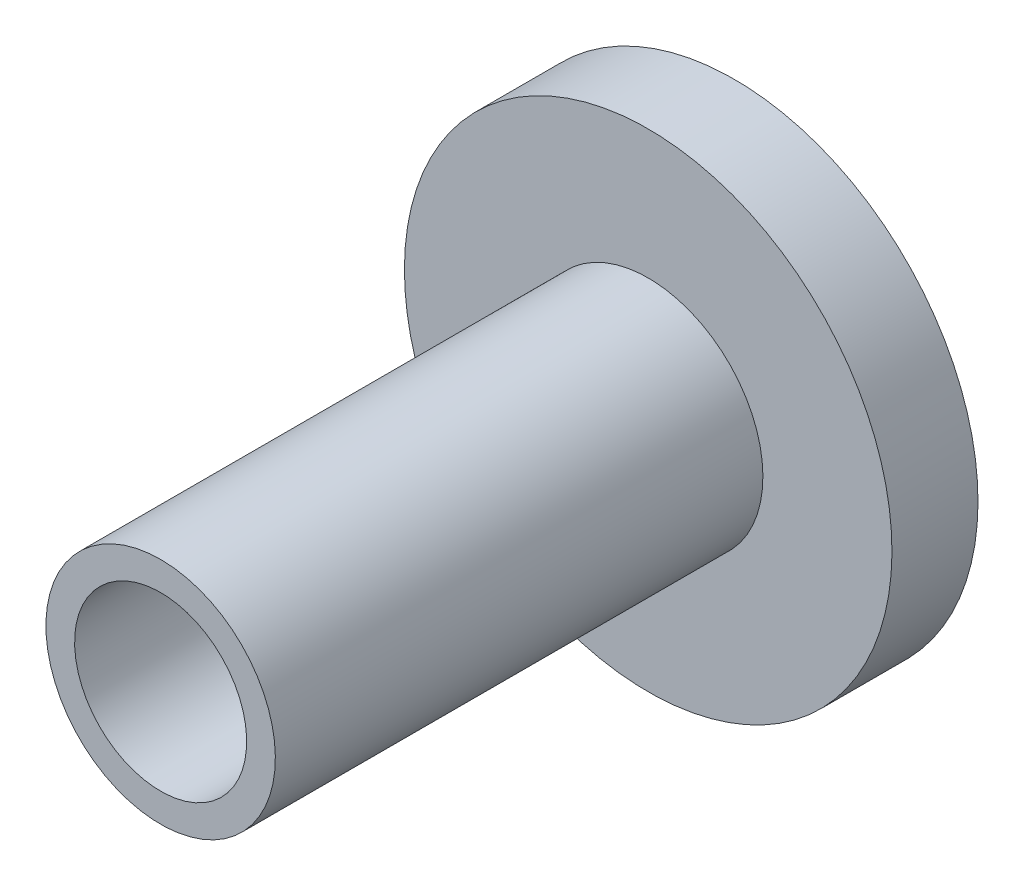
ISO-10303-21;
HEADER;
FILE_DESCRIPTION(('STEP AP214'),'2;1');
FILE_NAME('part.step','',(''),(''),'','','');
FILE_SCHEMA(('AUTOMOTIVE_DESIGN { 1 0 10303 214 1 1 1 1 }'));
ENDSEC;
DATA;
#1=APPLICATION_CONTEXT('core data for automotive mechanical design processes');
#2=APPLICATION_PROTOCOL_DEFINITION('international standard','automotive_design',2000,#1);
#3=PRODUCT_CONTEXT('',#1,'mechanical');
#4=PRODUCT('Part','Part','',(#3));
#5=PRODUCT_RELATED_PRODUCT_CATEGORY('part','',(#4));
#6=PRODUCT_DEFINITION_FORMATION('','',#4);
#7=PRODUCT_DEFINITION_CONTEXT('part definition',#1,'design');
#8=PRODUCT_DEFINITION('design','',#6,#7);
#9=PRODUCT_DEFINITION_SHAPE('','',#8);
#10=(LENGTH_UNIT() NAMED_UNIT(*) SI_UNIT(.MILLI.,.METRE.));
#11=(NAMED_UNIT(*) PLANE_ANGLE_UNIT() SI_UNIT($,.RADIAN.));
#12=(NAMED_UNIT(*) SI_UNIT($,.STERADIAN.) SOLID_ANGLE_UNIT());
#13=UNCERTAINTY_MEASURE_WITH_UNIT(LENGTH_MEASURE(1.E-05),#10,'distance_accuracy_value','');
#14=(GEOMETRIC_REPRESENTATION_CONTEXT(3) GLOBAL_UNCERTAINTY_ASSIGNED_CONTEXT((#13)) GLOBAL_UNIT_ASSIGNED_CONTEXT((#10,
#11,#12)) REPRESENTATION_CONTEXT('',''));
#15=CARTESIAN_POINT('',(0.,0.,0.));
#16=DIRECTION('',(0.,0.,1.));
#17=DIRECTION('',(1.,0.,0.));
#18=AXIS2_PLACEMENT_3D('',#15,#16,#17);
#19=CARTESIAN_POINT('',(4.37678810736121,-168.89010860896,356.074757540733));
#20=DIRECTION('',(0.,0.,-1.));
#21=DIRECTION('',(0.,-1.,0.));
#22=AXIS2_PLACEMENT_3D('',#19,#20,#21);
#23=PLANE('',#22);
#24=CARTESIAN_POINT('',(4.37678810736121,-168.89010860896,356.074757540733));
#25=DIRECTION('',(0.,0.,1.));
#26=DIRECTION('',(-0.951056516295153,0.309016994374948,0.));
#27=AXIS2_PLACEMENT_3D('',#24,#25,#26);
#28=CIRCLE('',#27,1.5);
#29=CARTESIAN_POINT('',(2.95020333291848,-168.426583117397,356.074757540733));
#30=VERTEX_POINT('',#29);
#31=EDGE_CURVE('E11',#30,#30,#28,.T.);
#32=ORIENTED_EDGE('',*,*,#31,.T.);
#33=EDGE_LOOP('',(#32));
#34=FACE_BOUND('',#33,.T.);
#35=ADVANCED_FACE('F43',(#34),#23,.F.);
#36=CARTESIAN_POINT('',(4.37678810736121,-168.89010860896,364.274757540733));
#37=DIRECTION('',(0.,0.,-1.));
#38=DIRECTION('',(0.309016994374947,0.951056516295154,0.));
#39=AXIS2_PLACEMENT_3D('',#36,#37,#38);
#40=CYLINDRICAL_SURFACE('',#39,1.5);
#41=ORIENTED_EDGE('',*,*,#31,.F.);
#42=EDGE_LOOP('',(#41));
#43=FACE_BOUND('',#42,.T.);
#44=CARTESIAN_POINT('',(4.37678810736121,-168.89010860896,364.574757540733));
#45=DIRECTION('',(0.,0.,1.));
#46=DIRECTION('',(0.951056516295153,-0.309016994374948,0.));
#47=AXIS2_PLACEMENT_3D('',#44,#45,#46);
#48=CIRCLE('',#47,1.5);
#49=CARTESIAN_POINT('',(5.80337288180394,-169.353634100522,364.574757540733));
#50=VERTEX_POINT('',#49);
#51=EDGE_CURVE('E52',#50,#50,#48,.T.);
#52=ORIENTED_EDGE('',*,*,#51,.T.);
#53=EDGE_LOOP('',(#52));
#54=FACE_BOUND('',#53,.T.);
#55=ADVANCED_FACE('F205',(#43,#54),#40,.F.);
#56=CARTESIAN_POINT('',(4.37678810736121,-168.89010860896,364.574757540733));
#57=DIRECTION('',(0.,0.,1.));
#58=DIRECTION('',(1.,0.,0.));
#59=AXIS2_PLACEMENT_3D('',#56,#57,#58);
#60=PLANE('',#59);
#61=CARTESIAN_POINT('',(4.37678810736121,-168.89010860896,364.574757540733));
#62=DIRECTION('',(0.,0.,1.));
#63=DIRECTION('',(0.951056516295152,-0.309016994374953,0.));
#64=AXIS2_PLACEMENT_3D('',#61,#62,#63);
#65=CIRCLE('',#64,2.);
#66=CARTESIAN_POINT('',(6.27890113995152,-169.508142597709,364.574757540733));
#67=VERTEX_POINT('',#66);
#68=EDGE_CURVE('E79',#67,#67,#65,.T.);
#69=ORIENTED_EDGE('',*,*,#68,.T.);
#70=EDGE_LOOP('',(#69));
#71=FACE_BOUND('',#70,.T.);
#72=ORIENTED_EDGE('',*,*,#51,.F.);
#73=EDGE_LOOP('',(#72));
#74=FACE_BOUND('',#73,.T.);
#75=ADVANCED_FACE('F211',(#71,#74),#60,.T.);
#76=CARTESIAN_POINT('',(-47.7978887522086,-256.655723143352,355.524757540733));
#77=DIRECTION('',(0.,0.,-1.));
#78=DIRECTION('',(0.,-1.,0.));
#79=AXIS2_PLACEMENT_3D('',#76,#77,#78);
#80=PLANE('',#79);
#81=DIRECTION('',(-0.207911690817758,0.978147600733806,0.));
#82=VECTOR('',#81,1.);
#83=CARTESIAN_POINT('',(18.5029435175928,-242.563046200222,355.524757540733));
#84=LINE('',#83,#82);
#85=CARTESIAN_POINT('',(3.08962351225286,-170.049076816073,355.524757540733));
#86=VERTEX_POINT('',#85);
#87=CARTESIAN_POINT('',(2.72950990026894,-168.3548754743,355.524757540733));
#88=VERTEX_POINT('',#87);
#89=EDGE_CURVE('E126',#86,#88,#84,.T.);
#90=ORIENTED_EDGE('',*,*,#89,.T.);
#91=DIRECTION('',(0.743144825477395,0.669130606358857,0.));
#92=VECTOR('',#91,1.);
#93=CARTESIAN_POINT('',(-69.0835282862229,-233.015625490732,355.524757540733));
#94=LINE('',#93,#92);
#95=CARTESIAN_POINT('',(4.01667449537771,-167.195907267187,355.524757540733));
#96=VERTEX_POINT('',#95);
#97=EDGE_CURVE('E154',#88,#96,#94,.T.);
#98=ORIENTED_EDGE('',*,*,#97,.T.);
#99=DIRECTION('',(0.951056516295153,-0.309016994374949,0.));
#100=VECTOR('',#99,1.);
#101=CARTESIAN_POINT('',(-16.5584580177169,-160.510641461081,355.524757540733));
#102=LINE('',#101,#100);
#103=CARTESIAN_POINT('',(5.66395270247036,-167.731140401847,355.524757540733));
#104=VERTEX_POINT('',#103);
#105=EDGE_CURVE('E110',#96,#104,#102,.T.);
#106=ORIENTED_EDGE('',*,*,#105,.T.);
#107=DIRECTION('',(0.207911690817758,-0.978147600733806,0.));
#108=VECTOR('',#107,1.);
#109=CARTESIAN_POINT('',(21.437386319794,-241.939311127769,355.524757540733));
#110=LINE('',#109,#108);
#111=CARTESIAN_POINT('',(6.02406631445428,-169.425341743619,355.524757540733));
#112=VERTEX_POINT('',#111);
#113=EDGE_CURVE('E114',#104,#112,#110,.T.);
#114=ORIENTED_EDGE('',*,*,#113,.T.);
#115=DIRECTION('',(-0.743144825477395,-0.669130606358858,0.));
#116=VECTOR('',#115,1.);
#117=CARTESIAN_POINT('',(-67.0761364671462,-235.245059967164,355.524757540733));
#118=LINE('',#117,#116);
#119=CARTESIAN_POINT('',(4.7369017193455,-170.584309950733,355.524757540733));
#120=VERTEX_POINT('',#119);
#121=EDGE_CURVE('E129',#112,#120,#118,.T.);
#122=ORIENTED_EDGE('',*,*,#121,.T.);
#123=DIRECTION('',(-0.951056516295153,0.309016994374949,0.));
#124=VECTOR('',#123,1.);
#125=CARTESIAN_POINT('',(-17.4855090008418,-163.363811009966,355.524757540733));
#126=LINE('',#125,#124);
#127=EDGE_CURVE('E122',#120,#86,#126,.T.);
#128=ORIENTED_EDGE('',*,*,#127,.T.);
#129=EDGE_LOOP('',(#90,#98,#106,#114,#122,#128));
#130=FACE_BOUND('',#129,.T.);
#131=ADVANCED_FACE('F124',(#130),#80,.T.);
#132=CARTESIAN_POINT('',(3.90941077911864,-167.292487951114,355.274757540733));
#133=DIRECTION('',(-0.669130606358857,0.743144825477395,0.));
#134=DIRECTION('',(0.,0.,1.));
#135=AXIS2_PLACEMENT_3D('',#132,#133,#134);
#136=PLANE('',#135);
#137=DIRECTION('',(-0.743144825477396,-0.669130606358857,0.));
#138=VECTOR('',#137,1.);
#139=CARTESIAN_POINT('',(3.90941077911864,-167.292487951114,354.574757540733));
#140=LINE('',#139,#138);
#141=CARTESIAN_POINT('',(4.01667449537771,-167.195907267187,354.574757540733));
#142=VERTEX_POINT('',#141);
#143=CARTESIAN_POINT('',(2.72950990026894,-168.3548754743,354.574757540733));
#144=VERTEX_POINT('',#143);
#145=EDGE_CURVE('E146',#142,#144,#140,.T.);
#146=ORIENTED_EDGE('',*,*,#145,.F.);
#147=DIRECTION('',(0.,0.,1.));
#148=VECTOR('',#147,1.);
#149=CARTESIAN_POINT('',(4.01667449537771,-167.195907267187,355.274757540733));
#150=LINE('',#149,#148);
#151=EDGE_CURVE('E151',#142,#96,#150,.T.);
#152=ORIENTED_EDGE('',*,*,#151,.T.);
#153=ORIENTED_EDGE('',*,*,#97,.F.);
#154=DIRECTION('',(0.,0.,1.));
#155=VECTOR('',#154,1.);
#156=CARTESIAN_POINT('',(2.72950990026894,-168.3548754743,355.274757540733));
#157=LINE('',#156,#155);
#158=EDGE_CURVE('E144',#144,#88,#157,.T.);
#159=ORIENTED_EDGE('',*,*,#158,.F.);
#160=EDGE_LOOP('',(#146,#152,#153,#159));
#161=FACE_BOUND('',#160,.T.);
#162=ADVANCED_FACE('F186',(#161),#136,.F.);
#163=CARTESIAN_POINT('',(5.52667951854598,-167.686537640625,355.274757540733));
#164=DIRECTION('',(0.309016994374949,0.951056516295153,0.));
#165=DIRECTION('',(0.,0.,-1.));
#166=AXIS2_PLACEMENT_3D('',#163,#164,#165);
#167=PLANE('',#166);
#168=DIRECTION('',(-0.951056516295153,0.309016994374949,0.));
#169=VECTOR('',#168,1.);
#170=CARTESIAN_POINT('',(5.52667951854598,-167.686537640625,354.574757540733));
#171=LINE('',#170,#169);
#172=CARTESIAN_POINT('',(5.66395270247036,-167.731140401847,354.574757540733));
#173=VERTEX_POINT('',#172);
#174=EDGE_CURVE('E165',#173,#142,#171,.T.);
#175=ORIENTED_EDGE('',*,*,#174,.F.);
#176=DIRECTION('',(0.,0.,1.));
#177=VECTOR('',#176,1.);
#178=CARTESIAN_POINT('',(5.66395270247036,-167.731140401847,355.274757540733));
#179=LINE('',#178,#177);
#180=EDGE_CURVE('E152',#173,#104,#179,.T.);
#181=ORIENTED_EDGE('',*,*,#180,.T.);
#182=ORIENTED_EDGE('',*,*,#105,.F.);
#183=ORIENTED_EDGE('',*,*,#151,.F.);
#184=EDGE_LOOP('',(#175,#181,#182,#183));
#185=FACE_BOUND('',#184,.T.);
#186=ADVANCED_FACE('F188',(#185),#167,.F.);
#187=CARTESIAN_POINT('',(5.99405684678894,-169.284158298472,346.074757540733));
#188=DIRECTION('',(0.978147600733806,0.207911690817758,0.));
#189=DIRECTION('',(0.,0.,-1.));
#190=AXIS2_PLACEMENT_3D('',#187,#188,#189);
#191=PLANE('',#190);
#192=DIRECTION('',(-0.207911690817757,0.978147600733806,0.));
#193=VECTOR('',#192,1.);
#194=CARTESIAN_POINT('',(5.99405684678894,-169.284158298472,354.574757540733));
#195=LINE('',#194,#193);
#196=CARTESIAN_POINT('',(6.02406631445428,-169.425341743619,354.574757540733));
#197=VERTEX_POINT('',#196);
#198=EDGE_CURVE('E47',#197,#173,#195,.T.);
#199=ORIENTED_EDGE('',*,*,#198,.F.);
#200=DIRECTION('',(0.,0.,1.));
#201=VECTOR('',#200,1.);
#202=CARTESIAN_POINT('',(6.02406631445428,-169.425341743619,346.074757540733));
#203=LINE('',#202,#201);
#204=EDGE_CURVE('E171',#197,#112,#203,.T.);
#205=ORIENTED_EDGE('',*,*,#204,.T.);
#206=ORIENTED_EDGE('',*,*,#113,.F.);
#207=ORIENTED_EDGE('',*,*,#180,.F.);
#208=EDGE_LOOP('',(#199,#205,#206,#207));
#209=FACE_BOUND('',#208,.T.);
#210=ADVANCED_FACE('F191',(#209),#191,.F.);
#211=CARTESIAN_POINT('',(4.84416543560456,-170.487729266806,346.074757540733));
#212=DIRECTION('',(0.669130606358858,-0.743144825477395,0.));
#213=DIRECTION('',(0.,0.,-1.));
#214=AXIS2_PLACEMENT_3D('',#211,#212,#213);
#215=PLANE('',#214);
#216=DIRECTION('',(0.743144825477395,0.669130606358858,0.));
#217=VECTOR('',#216,1.);
#218=CARTESIAN_POINT('',(4.84416543560456,-170.487729266806,354.574757540733));
#219=LINE('',#218,#217);
#220=CARTESIAN_POINT('',(4.7369017193455,-170.584309950733,354.574757540733));
#221=VERTEX_POINT('',#220);
#222=EDGE_CURVE('E160',#221,#197,#219,.T.);
#223=ORIENTED_EDGE('',*,*,#222,.F.);
#224=DIRECTION('',(0.,0.,1.));
#225=VECTOR('',#224,1.);
#226=CARTESIAN_POINT('',(4.7369017193455,-170.584309950733,355.274757540733));
#227=LINE('',#226,#225);
#228=EDGE_CURVE('E132',#221,#120,#227,.T.);
#229=ORIENTED_EDGE('',*,*,#228,.T.);
#230=ORIENTED_EDGE('',*,*,#121,.F.);
#231=ORIENTED_EDGE('',*,*,#204,.F.);
#232=EDGE_LOOP('',(#223,#229,#230,#231));
#233=FACE_BOUND('',#232,.T.);
#234=ADVANCED_FACE('F193',(#233),#215,.F.);
#235=CARTESIAN_POINT('',(3.22689669617726,-170.093679577295,355.274757540733));
#236=DIRECTION('',(-0.309016994374949,-0.951056516295153,0.));
#237=DIRECTION('',(-0.951056516295153,0.309016994374949,0.));
#238=AXIS2_PLACEMENT_3D('',#235,#236,#237);
#239=PLANE('',#238);
#240=DIRECTION('',(0.951056516295153,-0.309016994374949,0.));
#241=VECTOR('',#240,1.);
#242=CARTESIAN_POINT('',(3.22689669617726,-170.093679577295,354.574757540733));
#243=LINE('',#242,#241);
#244=CARTESIAN_POINT('',(3.08962351225286,-170.049076816073,354.574757540733));
#245=VERTEX_POINT('',#244);
#246=EDGE_CURVE('E138',#245,#221,#243,.T.);
#247=ORIENTED_EDGE('',*,*,#246,.F.);
#248=DIRECTION('',(0.,0.,1.));
#249=VECTOR('',#248,1.);
#250=CARTESIAN_POINT('',(3.08962351225286,-170.049076816073,355.274757540733));
#251=LINE('',#250,#249);
#252=EDGE_CURVE('E133',#245,#86,#251,.T.);
#253=ORIENTED_EDGE('',*,*,#252,.T.);
#254=ORIENTED_EDGE('',*,*,#127,.F.);
#255=ORIENTED_EDGE('',*,*,#228,.F.);
#256=EDGE_LOOP('',(#247,#253,#254,#255));
#257=FACE_BOUND('',#256,.T.);
#258=ADVANCED_FACE('F136',(#257),#239,.F.);
#259=CARTESIAN_POINT('',(2.75951936793427,-168.496058919448,355.274757540733));
#260=DIRECTION('',(-0.978147600733806,-0.207911690817758,0.));
#261=DIRECTION('',(-0.207911690817758,0.978147600733806,0.));
#262=AXIS2_PLACEMENT_3D('',#259,#260,#261);
#263=PLANE('',#262);
#264=DIRECTION('',(0.207911690817758,-0.978147600733806,0.));
#265=VECTOR('',#264,1.);
#266=CARTESIAN_POINT('',(2.75951936793427,-168.496058919448,354.574757540733));
#267=LINE('',#266,#265);
#268=EDGE_CURVE('E158',#144,#245,#267,.T.);
#269=ORIENTED_EDGE('',*,*,#268,.F.);
#270=ORIENTED_EDGE('',*,*,#158,.T.);
#271=ORIENTED_EDGE('',*,*,#89,.F.);
#272=ORIENTED_EDGE('',*,*,#252,.F.);
#273=EDGE_LOOP('',(#269,#270,#271,#272));
#274=FACE_BOUND('',#273,.T.);
#275=ADVANCED_FACE('F45',(#274),#263,.F.);
#276=CARTESIAN_POINT('',(4.37678810736121,-168.89010860896,354.574757540733));
#277=DIRECTION('',(0.,0.,-1.));
#278=DIRECTION('',(0.,-1.,0.));
#279=AXIS2_PLACEMENT_3D('',#276,#277,#278);
#280=PLANE('',#279);
#281=ORIENTED_EDGE('',*,*,#268,.T.);
#282=ORIENTED_EDGE('',*,*,#246,.T.);
#283=ORIENTED_EDGE('',*,*,#222,.T.);
#284=ORIENTED_EDGE('',*,*,#198,.T.);
#285=ORIENTED_EDGE('',*,*,#174,.T.);
#286=ORIENTED_EDGE('',*,*,#145,.T.);
#287=EDGE_LOOP('',(#281,#282,#283,#284,#285,#286));
#288=FACE_BOUND('',#287,.T.);
#289=CARTESIAN_POINT('',(4.37678810736119,-168.89010860896,354.574757540733));
#290=DIRECTION('',(0.,0.,-1.));
#291=DIRECTION('',(-0.951056516295153,0.30901699437495,0.));
#292=AXIS2_PLACEMENT_3D('',#289,#290,#291);
#293=CIRCLE('',#292,4.25);
#294=CARTESIAN_POINT('',(0.334797913106795,-167.576786382866,354.574757540733));
#295=VERTEX_POINT('',#294);
#296=EDGE_CURVE('E159',#295,#295,#293,.T.);
#297=ORIENTED_EDGE('',*,*,#296,.T.);
#298=EDGE_LOOP('',(#297));
#299=FACE_BOUND('',#298,.T.);
#300=ADVANCED_FACE('F182',(#288,#299),#280,.T.);
#301=CARTESIAN_POINT('',(4.37678810736121,-168.89010860896,356.074757540733));
#302=DIRECTION('',(0.,0.,-1.));
#303=DIRECTION('',(0.,-1.,0.));
#304=AXIS2_PLACEMENT_3D('',#301,#302,#303);
#305=PLANE('',#304);
#306=CARTESIAN_POINT('',(4.37678810736119,-168.89010860896,356.074757540733));
#307=DIRECTION('',(0.,0.,-1.));
#308=DIRECTION('',(-0.951056516295153,0.30901699437495,0.));
#309=AXIS2_PLACEMENT_3D('',#306,#307,#308);
#310=CIRCLE('',#309,4.25);
#311=CARTESIAN_POINT('',(0.334797913106795,-167.576786382866,356.074757540733));
#312=VERTEX_POINT('',#311);
#313=EDGE_CURVE('E85',#312,#312,#310,.T.);
#314=ORIENTED_EDGE('',*,*,#313,.F.);
#315=EDGE_LOOP('',(#314));
#316=FACE_BOUND('',#315,.T.);
#317=CARTESIAN_POINT('',(4.37678810736121,-168.89010860896,356.074757540733));
#318=DIRECTION('',(0.,0.,-1.));
#319=DIRECTION('',(-0.951056516295152,0.309016994374953,0.));
#320=AXIS2_PLACEMENT_3D('',#317,#318,#319);
#321=CIRCLE('',#320,2.);
#322=CARTESIAN_POINT('',(2.4746750747709,-168.27207462021,356.074757540733));
#323=VERTEX_POINT('',#322);
#324=EDGE_CURVE('E157',#323,#323,#321,.T.);
#325=ORIENTED_EDGE('',*,*,#324,.T.);
#326=EDGE_LOOP('',(#325));
#327=FACE_BOUND('',#326,.T.);
#328=ADVANCED_FACE('F235',(#316,#327),#305,.F.);
#329=CARTESIAN_POINT('',(4.37678810736119,-168.89010860896,330.274757540733));
#330=DIRECTION('',(0.,0.,1.));
#331=DIRECTION('',(0.309016994374948,0.951056516295153,0.));
#332=AXIS2_PLACEMENT_3D('',#329,#330,#331);
#333=CYLINDRICAL_SURFACE('',#332,4.25);
#334=ORIENTED_EDGE('',*,*,#296,.F.);
#335=EDGE_LOOP('',(#334));
#336=FACE_BOUND('',#335,.T.);
#337=ORIENTED_EDGE('',*,*,#313,.T.);
#338=EDGE_LOOP('',(#337));
#339=FACE_BOUND('',#338,.T.);
#340=ADVANCED_FACE('F232',(#336,#339),#333,.T.);
#341=CARTESIAN_POINT('',(4.37678810736121,-168.89010860896,345.074757540733));
#342=DIRECTION('',(0.,0.,1.));
#343=DIRECTION('',(-0.30901699437495,-0.951056516295153,0.));
#344=AXIS2_PLACEMENT_3D('',#341,#342,#343);
#345=CYLINDRICAL_SURFACE('',#344,2.);
#346=ORIENTED_EDGE('',*,*,#68,.F.);
#347=EDGE_LOOP('',(#346));
#348=FACE_BOUND('',#347,.T.);
#349=ORIENTED_EDGE('',*,*,#324,.F.);
#350=EDGE_LOOP('',(#349));
#351=FACE_BOUND('',#350,.T.);
#352=ADVANCED_FACE('F234',(#348,#351),#345,.T.);
#353=CLOSED_SHELL('',(#35,#55,#75,#131,#162,#186,#210,#234,#258,#275,#300,#328,#340,#352));
#354=MANIFOLD_SOLID_BREP('B2',#353);
#355=ADVANCED_BREP_SHAPE_REPRESENTATION('',(#18,#354),#14);
#356=SHAPE_DEFINITION_REPRESENTATION(#9,#355);
ENDSEC;
END-ISO-10303-21;
